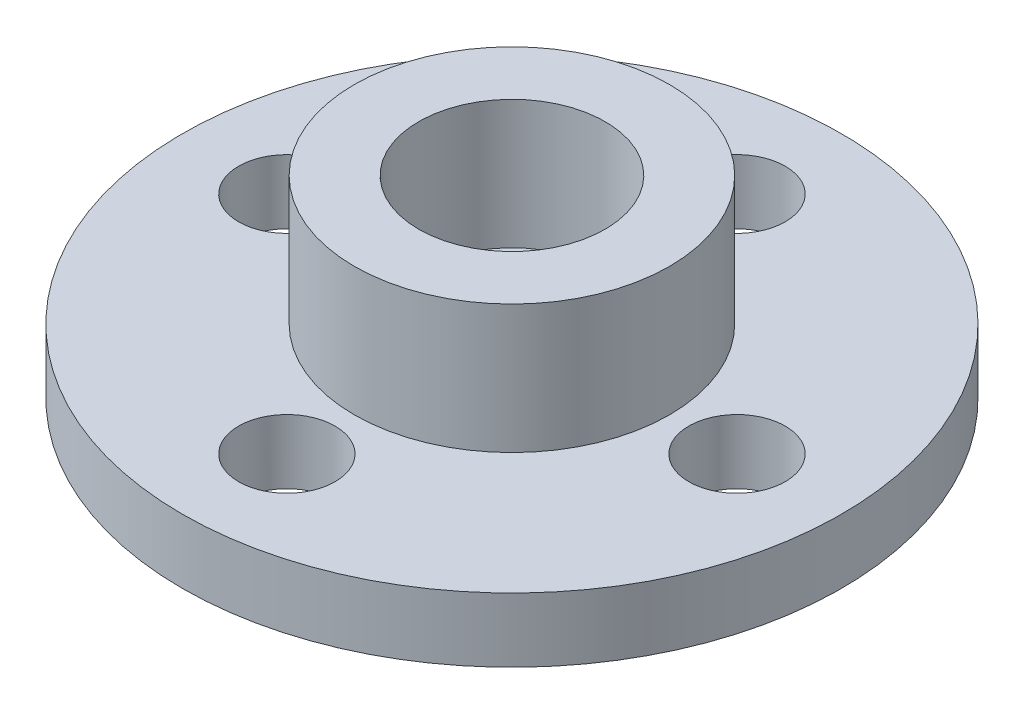
ISO-10303-21;
HEADER;
FILE_DESCRIPTION(('STEP AP214'),'2;1');
FILE_NAME('part.step','',(''),(''),'','','');
FILE_SCHEMA(('AUTOMOTIVE_DESIGN { 1 0 10303 214 1 1 1 1 }'));
ENDSEC;
DATA;
#1=APPLICATION_CONTEXT('core data for automotive mechanical design processes');
#2=APPLICATION_PROTOCOL_DEFINITION('international standard','automotive_design',2000,#1);
#3=PRODUCT_CONTEXT('',#1,'mechanical');
#4=PRODUCT('Part','Part','',(#3));
#5=PRODUCT_RELATED_PRODUCT_CATEGORY('part','',(#4));
#6=PRODUCT_DEFINITION_FORMATION('','',#4);
#7=PRODUCT_DEFINITION_CONTEXT('part definition',#1,'design');
#8=PRODUCT_DEFINITION('design','',#6,#7);
#9=PRODUCT_DEFINITION_SHAPE('','',#8);
#10=(LENGTH_UNIT() NAMED_UNIT(*) SI_UNIT(.MILLI.,.METRE.));
#11=(NAMED_UNIT(*) PLANE_ANGLE_UNIT() SI_UNIT($,.RADIAN.));
#12=(NAMED_UNIT(*) SI_UNIT($,.STERADIAN.) SOLID_ANGLE_UNIT());
#13=UNCERTAINTY_MEASURE_WITH_UNIT(LENGTH_MEASURE(1.E-05),#10,'distance_accuracy_value','');
#14=(GEOMETRIC_REPRESENTATION_CONTEXT(3) GLOBAL_UNCERTAINTY_ASSIGNED_CONTEXT((#13)) GLOBAL_UNIT_ASSIGNED_CONTEXT((#10,
#11,#12)) REPRESENTATION_CONTEXT('',''));
#15=CARTESIAN_POINT('',(0.,0.,0.));
#16=DIRECTION('',(0.,0.,1.));
#17=DIRECTION('',(1.,0.,0.));
#18=AXIS2_PLACEMENT_3D('',#15,#16,#17);
#19=CARTESIAN_POINT('',(0.,2.,0.));
#20=DIRECTION('',(0.,1.,0.));
#21=DIRECTION('',(0.,0.,1.));
#22=AXIS2_PLACEMENT_3D('',#19,#20,#21);
#23=PLANE('',#22);
#24=CARTESIAN_POINT('',(0.,2.,0.));
#25=DIRECTION('',(0.,1.,0.));
#26=DIRECTION('',(0.,0.,1.));
#27=AXIS2_PLACEMENT_3D('',#24,#25,#26);
#28=CIRCLE('',#27,1.5);
#29=CARTESIAN_POINT('',(0.,2.,1.5));
#30=VERTEX_POINT('',#29);
#31=EDGE_CURVE('E130',#30,#30,#28,.T.);
#32=ORIENTED_EDGE('',*,*,#31,.F.);
#33=EDGE_LOOP('',(#32));
#34=FACE_BOUND('',#33,.T.);
#35=CARTESIAN_POINT('',(0.,2.,0.));
#36=DIRECTION('',(0.,1.,0.));
#37=DIRECTION('',(0.,0.,1.));
#38=AXIS2_PLACEMENT_3D('',#35,#36,#37);
#39=CIRCLE('',#38,2.9);
#40=CARTESIAN_POINT('',(0.,2.,2.9));
#41=VERTEX_POINT('',#40);
#42=EDGE_CURVE('E11',#41,#41,#39,.F.);
#43=ORIENTED_EDGE('',*,*,#42,.F.);
#44=EDGE_LOOP('',(#43));
#45=FACE_BOUND('',#44,.T.);
#46=ADVANCED_FACE('F37',(#34,#45),#23,.T.);
#47=CARTESIAN_POINT('',(0.,2.,0.));
#48=DIRECTION('',(0.,-1.,0.));
#49=DIRECTION('',(0.,0.,-1.));
#50=AXIS2_PLACEMENT_3D('',#47,#48,#49);
#51=CYLINDRICAL_SURFACE('',#50,10.25);
#52=CARTESIAN_POINT('',(0.,2.,0.));
#53=DIRECTION('',(0.,1.,0.));
#54=DIRECTION('',(0.,0.,1.));
#55=AXIS2_PLACEMENT_3D('',#52,#53,#54);
#56=CIRCLE('',#55,10.25);
#57=CARTESIAN_POINT('',(0.,2.,10.25));
#58=VERTEX_POINT('',#57);
#59=EDGE_CURVE('E44',#58,#58,#56,.T.);
#60=ORIENTED_EDGE('',*,*,#59,.F.);
#61=EDGE_LOOP('',(#60));
#62=FACE_BOUND('',#61,.T.);
#63=CARTESIAN_POINT('',(0.,0.,0.));
#64=DIRECTION('',(0.,1.,0.));
#65=DIRECTION('',(0.,0.,1.));
#66=AXIS2_PLACEMENT_3D('',#63,#64,#65);
#67=CIRCLE('',#66,10.25);
#68=CARTESIAN_POINT('',(0.,0.,10.25));
#69=VERTEX_POINT('',#68);
#70=EDGE_CURVE('E48',#69,#69,#67,.T.);
#71=ORIENTED_EDGE('',*,*,#70,.T.);
#72=EDGE_LOOP('',(#71));
#73=FACE_BOUND('',#72,.T.);
#74=ADVANCED_FACE('F39',(#62,#73),#51,.T.);
#75=CARTESIAN_POINT('',(0.,2.,0.));
#76=DIRECTION('',(0.,1.,0.));
#77=DIRECTION('',(0.,0.,1.));
#78=AXIS2_PLACEMENT_3D('',#75,#76,#77);
#79=CIRCLE('',#78,4.9);
#80=CARTESIAN_POINT('',(0.,2.,4.9));
#81=VERTEX_POINT('',#80);
#82=EDGE_CURVE('E116',#81,#81,#79,.T.);
#83=ORIENTED_EDGE('',*,*,#82,.F.);
#84=EDGE_LOOP('',(#83));
#85=FACE_BOUND('',#84,.T.);
#86=CARTESIAN_POINT('',(7.,2.,0.));
#87=DIRECTION('',(0.,1.,0.));
#88=DIRECTION('',(0.,0.,1.));
#89=AXIS2_PLACEMENT_3D('',#86,#87,#88);
#90=CIRCLE('',#89,1.5);
#91=CARTESIAN_POINT('',(7.,2.,1.5));
#92=VERTEX_POINT('',#91);
#93=EDGE_CURVE('E63',#92,#92,#90,.T.);
#94=ORIENTED_EDGE('',*,*,#93,.F.);
#95=EDGE_LOOP('',(#94));
#96=FACE_BOUND('',#95,.T.);
#97=CARTESIAN_POINT('',(0.,2.,7.));
#98=DIRECTION('',(0.,1.,0.));
#99=DIRECTION('',(0.,0.,-1.));
#100=AXIS2_PLACEMENT_3D('',#97,#98,#99);
#101=CIRCLE('',#100,1.5);
#102=CARTESIAN_POINT('',(0.,2.,5.5));
#103=VERTEX_POINT('',#102);
#104=EDGE_CURVE('E122',#103,#103,#101,.T.);
#105=ORIENTED_EDGE('',*,*,#104,.F.);
#106=EDGE_LOOP('',(#105));
#107=FACE_BOUND('',#106,.T.);
#108=CARTESIAN_POINT('',(-7.,2.,0.));
#109=DIRECTION('',(0.,1.,0.));
#110=DIRECTION('',(0.,0.,1.));
#111=AXIS2_PLACEMENT_3D('',#108,#109,#110);
#112=CIRCLE('',#111,1.5);
#113=CARTESIAN_POINT('',(-7.,2.,1.5));
#114=VERTEX_POINT('',#113);
#115=EDGE_CURVE('E126',#114,#114,#112,.T.);
#116=ORIENTED_EDGE('',*,*,#115,.F.);
#117=EDGE_LOOP('',(#116));
#118=FACE_BOUND('',#117,.T.);
#119=CARTESIAN_POINT('',(0.,2.,-7.));
#120=DIRECTION('',(0.,1.,0.));
#121=DIRECTION('',(0.,0.,-1.));
#122=AXIS2_PLACEMENT_3D('',#119,#120,#121);
#123=CIRCLE('',#122,1.5);
#124=CARTESIAN_POINT('',(0.,2.,-8.5));
#125=VERTEX_POINT('',#124);
#126=EDGE_CURVE('E56',#125,#125,#123,.T.);
#127=ORIENTED_EDGE('',*,*,#126,.F.);
#128=EDGE_LOOP('',(#127));
#129=FACE_BOUND('',#128,.T.);
#130=ORIENTED_EDGE('',*,*,#59,.T.);
#131=EDGE_LOOP('',(#130));
#132=FACE_BOUND('',#131,.T.);
#133=ADVANCED_FACE('F99',(#85,#96,#107,#118,#129,#132),#23,.T.);
#134=CARTESIAN_POINT('',(0.,0.,0.));
#135=DIRECTION('',(0.,1.,0.));
#136=DIRECTION('',(0.,0.,1.));
#137=AXIS2_PLACEMENT_3D('',#134,#135,#136);
#138=PLANE('',#137);
#139=CARTESIAN_POINT('',(7.,0.,0.));
#140=DIRECTION('',(0.,1.,0.));
#141=DIRECTION('',(0.,0.,1.));
#142=AXIS2_PLACEMENT_3D('',#139,#140,#141);
#143=CIRCLE('',#142,1.5);
#144=CARTESIAN_POINT('',(7.,0.,1.5));
#145=VERTEX_POINT('',#144);
#146=EDGE_CURVE('E53',#145,#145,#143,.T.);
#147=ORIENTED_EDGE('',*,*,#146,.T.);
#148=EDGE_LOOP('',(#147));
#149=FACE_BOUND('',#148,.T.);
#150=CARTESIAN_POINT('',(0.,0.,7.));
#151=DIRECTION('',(0.,1.,0.));
#152=DIRECTION('',(0.,0.,1.));
#153=AXIS2_PLACEMENT_3D('',#150,#151,#152);
#154=CIRCLE('',#153,1.5);
#155=CARTESIAN_POINT('',(0.,0.,8.5));
#156=VERTEX_POINT('',#155);
#157=EDGE_CURVE('E69',#156,#156,#154,.T.);
#158=ORIENTED_EDGE('',*,*,#157,.T.);
#159=EDGE_LOOP('',(#158));
#160=FACE_BOUND('',#159,.T.);
#161=CARTESIAN_POINT('',(-7.,0.,0.));
#162=DIRECTION('',(0.,1.,0.));
#163=DIRECTION('',(0.,0.,1.));
#164=AXIS2_PLACEMENT_3D('',#161,#162,#163);
#165=CIRCLE('',#164,1.5);
#166=CARTESIAN_POINT('',(-7.,0.,1.5));
#167=VERTEX_POINT('',#166);
#168=EDGE_CURVE('E66',#167,#167,#165,.T.);
#169=ORIENTED_EDGE('',*,*,#168,.T.);
#170=EDGE_LOOP('',(#169));
#171=FACE_BOUND('',#170,.T.);
#172=CARTESIAN_POINT('',(0.,0.,-7.));
#173=DIRECTION('',(0.,1.,0.));
#174=DIRECTION('',(0.,0.,1.));
#175=AXIS2_PLACEMENT_3D('',#172,#173,#174);
#176=CIRCLE('',#175,1.5);
#177=CARTESIAN_POINT('',(0.,0.,-5.5));
#178=VERTEX_POINT('',#177);
#179=EDGE_CURVE('E62',#178,#178,#176,.T.);
#180=ORIENTED_EDGE('',*,*,#179,.T.);
#181=EDGE_LOOP('',(#180));
#182=FACE_BOUND('',#181,.T.);
#183=CARTESIAN_POINT('',(0.,0.,0.));
#184=DIRECTION('',(0.,1.,0.));
#185=DIRECTION('',(0.,0.,1.));
#186=AXIS2_PLACEMENT_3D('',#183,#184,#185);
#187=CIRCLE('',#186,1.5);
#188=CARTESIAN_POINT('',(0.,0.,1.5));
#189=VERTEX_POINT('',#188);
#190=EDGE_CURVE('E59',#189,#189,#187,.T.);
#191=ORIENTED_EDGE('',*,*,#190,.T.);
#192=EDGE_LOOP('',(#191));
#193=FACE_BOUND('',#192,.T.);
#194=ORIENTED_EDGE('',*,*,#70,.F.);
#195=EDGE_LOOP('',(#194));
#196=FACE_BOUND('',#195,.T.);
#197=ADVANCED_FACE('F74',(#149,#160,#171,#182,#193,#196),#138,.F.);
#198=CARTESIAN_POINT('',(0.,-1.,0.));
#199=DIRECTION('',(0.,1.,0.));
#200=DIRECTION('',(0.,0.,1.));
#201=AXIS2_PLACEMENT_3D('',#198,#199,#200);
#202=CYLINDRICAL_SURFACE('',#201,1.5);
#203=ORIENTED_EDGE('',*,*,#31,.T.);
#204=EDGE_LOOP('',(#203));
#205=FACE_BOUND('',#204,.T.);
#206=ORIENTED_EDGE('',*,*,#190,.F.);
#207=EDGE_LOOP('',(#206));
#208=FACE_BOUND('',#207,.T.);
#209=ADVANCED_FACE('F112',(#205,#208),#202,.F.);
#210=CARTESIAN_POINT('',(0.,-1.,-7.));
#211=DIRECTION('',(0.,1.,0.));
#212=DIRECTION('',(0.,0.,1.));
#213=AXIS2_PLACEMENT_3D('',#210,#211,#212);
#214=CYLINDRICAL_SURFACE('',#213,1.5);
#215=ORIENTED_EDGE('',*,*,#126,.T.);
#216=EDGE_LOOP('',(#215));
#217=FACE_BOUND('',#216,.T.);
#218=ORIENTED_EDGE('',*,*,#179,.F.);
#219=EDGE_LOOP('',(#218));
#220=FACE_BOUND('',#219,.T.);
#221=ADVANCED_FACE('F190',(#217,#220),#214,.F.);
#222=CARTESIAN_POINT('',(-7.,-1.,0.));
#223=DIRECTION('',(0.,1.,0.));
#224=DIRECTION('',(0.,0.,1.));
#225=AXIS2_PLACEMENT_3D('',#222,#223,#224);
#226=CYLINDRICAL_SURFACE('',#225,1.5);
#227=ORIENTED_EDGE('',*,*,#115,.T.);
#228=EDGE_LOOP('',(#227));
#229=FACE_BOUND('',#228,.T.);
#230=ORIENTED_EDGE('',*,*,#168,.F.);
#231=EDGE_LOOP('',(#230));
#232=FACE_BOUND('',#231,.T.);
#233=ADVANCED_FACE('F90',(#229,#232),#226,.F.);
#234=CARTESIAN_POINT('',(0.,-1.,7.));
#235=DIRECTION('',(0.,1.,0.));
#236=DIRECTION('',(0.,0.,1.));
#237=AXIS2_PLACEMENT_3D('',#234,#235,#236);
#238=CYLINDRICAL_SURFACE('',#237,1.5);
#239=ORIENTED_EDGE('',*,*,#104,.T.);
#240=EDGE_LOOP('',(#239));
#241=FACE_BOUND('',#240,.T.);
#242=ORIENTED_EDGE('',*,*,#157,.F.);
#243=EDGE_LOOP('',(#242));
#244=FACE_BOUND('',#243,.T.);
#245=ADVANCED_FACE('F80',(#241,#244),#238,.F.);
#246=CARTESIAN_POINT('',(7.,-1.,0.));
#247=DIRECTION('',(0.,1.,0.));
#248=DIRECTION('',(0.,0.,1.));
#249=AXIS2_PLACEMENT_3D('',#246,#247,#248);
#250=CYLINDRICAL_SURFACE('',#249,1.5);
#251=ORIENTED_EDGE('',*,*,#93,.T.);
#252=EDGE_LOOP('',(#251));
#253=FACE_BOUND('',#252,.T.);
#254=ORIENTED_EDGE('',*,*,#146,.F.);
#255=EDGE_LOOP('',(#254));
#256=FACE_BOUND('',#255,.T.);
#257=ADVANCED_FACE('F77',(#253,#256),#250,.F.);
#258=CARTESIAN_POINT('',(0.,6.,0.));
#259=DIRECTION('',(0.,1.,0.));
#260=DIRECTION('',(0.,0.,1.));
#261=AXIS2_PLACEMENT_3D('',#258,#259,#260);
#262=PLANE('',#261);
#263=CARTESIAN_POINT('',(0.,6.,0.));
#264=DIRECTION('',(0.,1.,0.));
#265=DIRECTION('',(0.,0.,1.));
#266=AXIS2_PLACEMENT_3D('',#263,#264,#265);
#267=CIRCLE('',#266,4.9);
#268=CARTESIAN_POINT('',(0.,6.,4.9));
#269=VERTEX_POINT('',#268);
#270=EDGE_CURVE('E134',#269,#269,#267,.T.);
#271=ORIENTED_EDGE('',*,*,#270,.T.);
#272=EDGE_LOOP('',(#271));
#273=FACE_BOUND('',#272,.T.);
#274=CARTESIAN_POINT('',(0.,6.,0.));
#275=DIRECTION('',(0.,1.,0.));
#276=DIRECTION('',(0.,0.,1.));
#277=AXIS2_PLACEMENT_3D('',#274,#275,#276);
#278=CIRCLE('',#277,2.9);
#279=CARTESIAN_POINT('',(0.,6.,2.9));
#280=VERTEX_POINT('',#279);
#281=EDGE_CURVE('E139',#280,#280,#278,.T.);
#282=ORIENTED_EDGE('',*,*,#281,.F.);
#283=EDGE_LOOP('',(#282));
#284=FACE_BOUND('',#283,.T.);
#285=ADVANCED_FACE('F79',(#273,#284),#262,.T.);
#286=CARTESIAN_POINT('',(0.,6.,0.));
#287=DIRECTION('',(0.,-1.,0.));
#288=DIRECTION('',(0.,0.,-1.));
#289=AXIS2_PLACEMENT_3D('',#286,#287,#288);
#290=CYLINDRICAL_SURFACE('',#289,4.9);
#291=ORIENTED_EDGE('',*,*,#270,.F.);
#292=EDGE_LOOP('',(#291));
#293=FACE_BOUND('',#292,.T.);
#294=ORIENTED_EDGE('',*,*,#82,.T.);
#295=EDGE_LOOP('',(#294));
#296=FACE_BOUND('',#295,.T.);
#297=ADVANCED_FACE('F87',(#293,#296),#290,.T.);
#298=CARTESIAN_POINT('',(0.,6.,0.));
#299=DIRECTION('',(0.,-1.,0.));
#300=DIRECTION('',(0.,0.,-1.));
#301=AXIS2_PLACEMENT_3D('',#298,#299,#300);
#302=CYLINDRICAL_SURFACE('',#301,2.9);
#303=ORIENTED_EDGE('',*,*,#281,.T.);
#304=EDGE_LOOP('',(#303));
#305=FACE_BOUND('',#304,.T.);
#306=ORIENTED_EDGE('',*,*,#42,.T.);
#307=EDGE_LOOP('',(#306));
#308=FACE_BOUND('',#307,.T.);
#309=ADVANCED_FACE('F145',(#305,#308),#302,.F.);
#310=CLOSED_SHELL('',(#46,#74,#133,#197,#209,#221,#233,#245,#257,#285,#297,#309));
#311=MANIFOLD_SOLID_BREP('B2',#310);
#312=ADVANCED_BREP_SHAPE_REPRESENTATION('',(#18,#311),#14);
#313=SHAPE_DEFINITION_REPRESENTATION(#9,#312);
ENDSEC;
END-ISO-10303-21;
